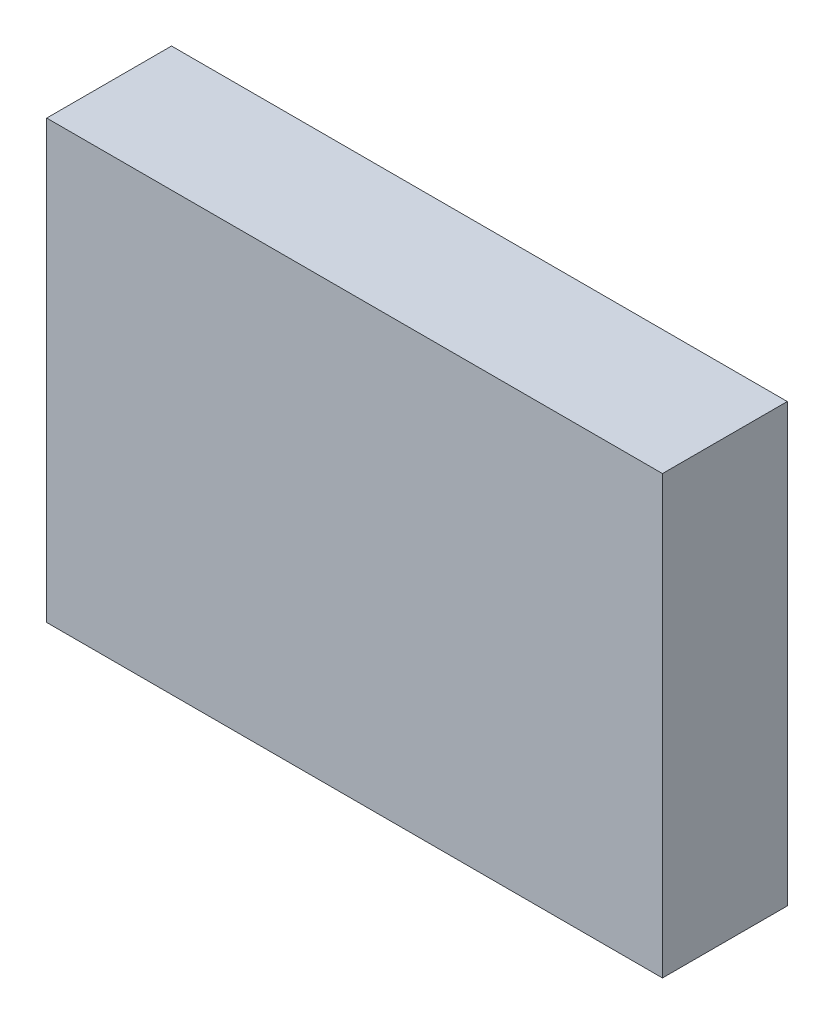
ISO-10303-21;
HEADER;
FILE_DESCRIPTION(('STEP AP214'),'2;1');
FILE_NAME('part.step','',(''),(''),'','','');
FILE_SCHEMA(('AUTOMOTIVE_DESIGN { 1 0 10303 214 1 1 1 1 }'));
ENDSEC;
DATA;
#1=APPLICATION_CONTEXT('core data for automotive mechanical design processes');
#2=APPLICATION_PROTOCOL_DEFINITION('international standard','automotive_design',2000,#1);
#3=PRODUCT_CONTEXT('',#1,'mechanical');
#4=PRODUCT('Part','Part','',(#3));
#5=PRODUCT_RELATED_PRODUCT_CATEGORY('part','',(#4));
#6=PRODUCT_DEFINITION_FORMATION('','',#4);
#7=PRODUCT_DEFINITION_CONTEXT('part definition',#1,'design');
#8=PRODUCT_DEFINITION('design','',#6,#7);
#9=PRODUCT_DEFINITION_SHAPE('','',#8);
#10=(LENGTH_UNIT() NAMED_UNIT(*) SI_UNIT(.MILLI.,.METRE.));
#11=(NAMED_UNIT(*) PLANE_ANGLE_UNIT() SI_UNIT($,.RADIAN.));
#12=(NAMED_UNIT(*) SI_UNIT($,.STERADIAN.) SOLID_ANGLE_UNIT());
#13=UNCERTAINTY_MEASURE_WITH_UNIT(LENGTH_MEASURE(1.E-05),#10,'distance_accuracy_value','');
#14=(GEOMETRIC_REPRESENTATION_CONTEXT(3) GLOBAL_UNCERTAINTY_ASSIGNED_CONTEXT((#13)) GLOBAL_UNIT_ASSIGNED_CONTEXT((#10,
#11,#12)) REPRESENTATION_CONTEXT('',''));
#15=CARTESIAN_POINT('',(0.,0.,0.));
#16=DIRECTION('',(0.,0.,1.));
#17=DIRECTION('',(1.,0.,0.));
#18=AXIS2_PLACEMENT_3D('',#15,#16,#17);
#19=CARTESIAN_POINT('',(74.,52.5,30.));
#20=DIRECTION('',(-1.,0.,0.));
#21=DIRECTION('',(0.,0.,1.));
#22=AXIS2_PLACEMENT_3D('',#19,#20,#21);
#23=PLANE('',#22);
#24=DIRECTION('',(0.,1.,0.));
#25=VECTOR('',#24,1.);
#26=CARTESIAN_POINT('',(74.,52.5,0.));
#27=LINE('',#26,#25);
#28=CARTESIAN_POINT('',(74.,-52.5,0.));
#29=VERTEX_POINT('',#28);
#30=CARTESIAN_POINT('',(74.,52.5,0.));
#31=VERTEX_POINT('',#30);
#32=EDGE_CURVE('E113',#29,#31,#27,.T.);
#33=ORIENTED_EDGE('',*,*,#32,.T.);
#34=DIRECTION('',(0.,0.,-1.));
#35=VECTOR('',#34,1.);
#36=CARTESIAN_POINT('',(74.,52.5,30.));
#37=LINE('',#36,#35);
#38=CARTESIAN_POINT('',(74.,52.5,30.));
#39=VERTEX_POINT('',#38);
#40=EDGE_CURVE('E11',#39,#31,#37,.T.);
#41=ORIENTED_EDGE('',*,*,#40,.F.);
#42=DIRECTION('',(0.,1.,0.));
#43=VECTOR('',#42,1.);
#44=CARTESIAN_POINT('',(74.,52.5,30.));
#45=LINE('',#44,#43);
#46=CARTESIAN_POINT('',(74.,-52.5,30.));
#47=VERTEX_POINT('',#46);
#48=EDGE_CURVE('E97',#47,#39,#45,.T.);
#49=ORIENTED_EDGE('',*,*,#48,.F.);
#50=DIRECTION('',(0.,0.,-1.));
#51=VECTOR('',#50,1.);
#52=CARTESIAN_POINT('',(74.,-52.5,30.));
#53=LINE('',#52,#51);
#54=EDGE_CURVE('E109',#47,#29,#53,.T.);
#55=ORIENTED_EDGE('',*,*,#54,.T.);
#56=EDGE_LOOP('',(#33,#41,#49,#55));
#57=FACE_BOUND('',#56,.T.);
#58=ADVANCED_FACE('F45',(#57),#23,.F.);
#59=CARTESIAN_POINT('',(-74.,52.5,30.));
#60=DIRECTION('',(0.,-1.,0.));
#61=DIRECTION('',(0.,0.,-1.));
#62=AXIS2_PLACEMENT_3D('',#59,#60,#61);
#63=PLANE('',#62);
#64=DIRECTION('',(-1.,0.,0.));
#65=VECTOR('',#64,1.);
#66=CARTESIAN_POINT('',(-74.,52.5,0.));
#67=LINE('',#66,#65);
#68=CARTESIAN_POINT('',(-74.,52.5,0.));
#69=VERTEX_POINT('',#68);
#70=EDGE_CURVE('E102',#31,#69,#67,.T.);
#71=ORIENTED_EDGE('',*,*,#70,.T.);
#72=DIRECTION('',(0.,0.,-1.));
#73=VECTOR('',#72,1.);
#74=CARTESIAN_POINT('',(-74.,52.5,30.));
#75=LINE('',#74,#73);
#76=CARTESIAN_POINT('',(-74.,52.5,30.));
#77=VERTEX_POINT('',#76);
#78=EDGE_CURVE('E54',#77,#69,#75,.T.);
#79=ORIENTED_EDGE('',*,*,#78,.F.);
#80=DIRECTION('',(-1.,0.,0.));
#81=VECTOR('',#80,1.);
#82=CARTESIAN_POINT('',(-74.,52.5,30.));
#83=LINE('',#82,#81);
#84=EDGE_CURVE('E92',#39,#77,#83,.T.);
#85=ORIENTED_EDGE('',*,*,#84,.F.);
#86=ORIENTED_EDGE('',*,*,#40,.T.);
#87=EDGE_LOOP('',(#71,#79,#85,#86));
#88=FACE_BOUND('',#87,.T.);
#89=ADVANCED_FACE('F101',(#88),#63,.F.);
#90=CARTESIAN_POINT('',(-74.,52.5,30.));
#91=DIRECTION('',(1.,0.,0.));
#92=DIRECTION('',(0.,1.,0.));
#93=AXIS2_PLACEMENT_3D('',#90,#91,#92);
#94=PLANE('',#93);
#95=DIRECTION('',(0.,-1.,0.));
#96=VECTOR('',#95,1.);
#97=CARTESIAN_POINT('',(-74.,52.5,0.));
#98=LINE('',#97,#96);
#99=CARTESIAN_POINT('',(-74.,-52.5,0.));
#100=VERTEX_POINT('',#99);
#101=EDGE_CURVE('E79',#69,#100,#98,.T.);
#102=ORIENTED_EDGE('',*,*,#101,.T.);
#103=DIRECTION('',(0.,0.,-1.));
#104=VECTOR('',#103,1.);
#105=CARTESIAN_POINT('',(-74.,-52.5,30.));
#106=LINE('',#105,#104);
#107=CARTESIAN_POINT('',(-74.,-52.5,30.));
#108=VERTEX_POINT('',#107);
#109=EDGE_CURVE('E104',#108,#100,#106,.T.);
#110=ORIENTED_EDGE('',*,*,#109,.F.);
#111=DIRECTION('',(0.,-1.,0.));
#112=VECTOR('',#111,1.);
#113=CARTESIAN_POINT('',(-74.,52.5,30.));
#114=LINE('',#113,#112);
#115=EDGE_CURVE('E95',#77,#108,#114,.T.);
#116=ORIENTED_EDGE('',*,*,#115,.F.);
#117=ORIENTED_EDGE('',*,*,#78,.T.);
#118=EDGE_LOOP('',(#102,#110,#116,#117));
#119=FACE_BOUND('',#118,.T.);
#120=ADVANCED_FACE('F105',(#119),#94,.F.);
#121=CARTESIAN_POINT('',(-74.,-52.5,30.));
#122=DIRECTION('',(0.,1.,0.));
#123=DIRECTION('',(0.,0.,1.));
#124=AXIS2_PLACEMENT_3D('',#121,#122,#123);
#125=PLANE('',#124);
#126=DIRECTION('',(1.,0.,0.));
#127=VECTOR('',#126,1.);
#128=CARTESIAN_POINT('',(-74.,-52.5,0.));
#129=LINE('',#128,#127);
#130=EDGE_CURVE('E85',#100,#29,#129,.T.);
#131=ORIENTED_EDGE('',*,*,#130,.T.);
#132=ORIENTED_EDGE('',*,*,#54,.F.);
#133=DIRECTION('',(1.,0.,0.));
#134=VECTOR('',#133,1.);
#135=CARTESIAN_POINT('',(-74.,-52.5,30.));
#136=LINE('',#135,#134);
#137=EDGE_CURVE('E62',#108,#47,#136,.T.);
#138=ORIENTED_EDGE('',*,*,#137,.F.);
#139=ORIENTED_EDGE('',*,*,#109,.T.);
#140=EDGE_LOOP('',(#131,#132,#138,#139));
#141=FACE_BOUND('',#140,.T.);
#142=ADVANCED_FACE('F126',(#141),#125,.F.);
#143=CARTESIAN_POINT('',(0.,0.,30.));
#144=DIRECTION('',(0.,0.,1.));
#145=DIRECTION('',(1.,0.,0.));
#146=AXIS2_PLACEMENT_3D('',#143,#144,#145);
#147=PLANE('',#146);
#148=ORIENTED_EDGE('',*,*,#48,.T.);
#149=ORIENTED_EDGE('',*,*,#84,.T.);
#150=ORIENTED_EDGE('',*,*,#115,.T.);
#151=ORIENTED_EDGE('',*,*,#137,.T.);
#152=EDGE_LOOP('',(#148,#149,#150,#151));
#153=FACE_BOUND('',#152,.T.);
#154=ADVANCED_FACE('F93',(#153),#147,.T.);
#155=CARTESIAN_POINT('',(0.,0.,0.));
#156=DIRECTION('',(0.,0.,1.));
#157=DIRECTION('',(1.,0.,0.));
#158=AXIS2_PLACEMENT_3D('',#155,#156,#157);
#159=PLANE('',#158);
#160=ORIENTED_EDGE('',*,*,#32,.F.);
#161=ORIENTED_EDGE('',*,*,#130,.F.);
#162=ORIENTED_EDGE('',*,*,#101,.F.);
#163=ORIENTED_EDGE('',*,*,#70,.F.);
#164=EDGE_LOOP('',(#160,#161,#162,#163));
#165=FACE_BOUND('',#164,.T.);
#166=ADVANCED_FACE('F129',(#165),#159,.F.);
#167=CLOSED_SHELL('',(#58,#89,#120,#142,#154,#166));
#168=MANIFOLD_SOLID_BREP('B2',#167);
#169=ADVANCED_BREP_SHAPE_REPRESENTATION('',(#18,#168),#14);
#170=SHAPE_DEFINITION_REPRESENTATION(#9,#169);
ENDSEC;
END-ISO-10303-21;
